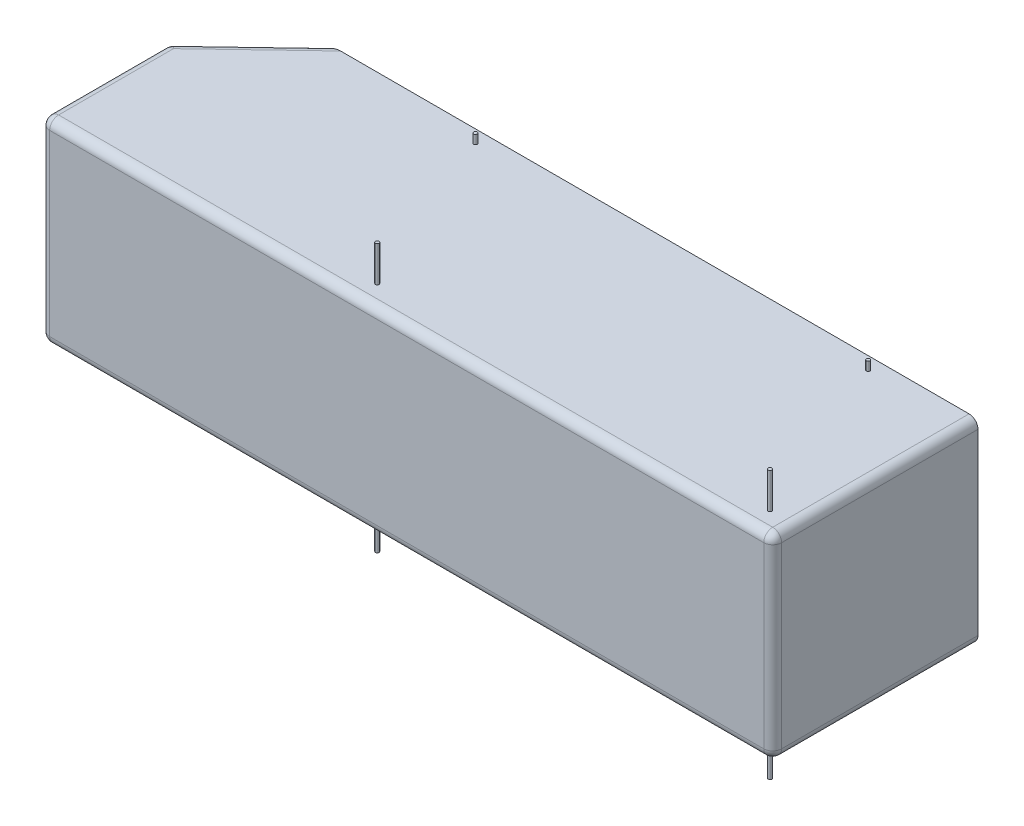
ISO-10303-21;
HEADER;
FILE_DESCRIPTION(('STEP AP214'),'2;1');
FILE_NAME('part.step','',(''),(''),'','','');
FILE_SCHEMA(('AUTOMOTIVE_DESIGN { 1 0 10303 214 1 1 1 1 }'));
ENDSEC;
DATA;
#1=APPLICATION_CONTEXT('core data for automotive mechanical design processes');
#2=APPLICATION_PROTOCOL_DEFINITION('international standard','automotive_design',2000,#1);
#3=PRODUCT_CONTEXT('',#1,'mechanical');
#4=PRODUCT('Part','Part','',(#3));
#5=PRODUCT_RELATED_PRODUCT_CATEGORY('part','',(#4));
#6=PRODUCT_DEFINITION_FORMATION('','',#4);
#7=PRODUCT_DEFINITION_CONTEXT('part definition',#1,'design');
#8=PRODUCT_DEFINITION('design','',#6,#7);
#9=PRODUCT_DEFINITION_SHAPE('','',#8);
#10=(LENGTH_UNIT() NAMED_UNIT(*) SI_UNIT(.MILLI.,.METRE.));
#11=(NAMED_UNIT(*) PLANE_ANGLE_UNIT() SI_UNIT($,.RADIAN.));
#12=(NAMED_UNIT(*) SI_UNIT($,.STERADIAN.) SOLID_ANGLE_UNIT());
#13=UNCERTAINTY_MEASURE_WITH_UNIT(LENGTH_MEASURE(1.E-05),#10,'distance_accuracy_value','');
#14=(GEOMETRIC_REPRESENTATION_CONTEXT(3) GLOBAL_UNCERTAINTY_ASSIGNED_CONTEXT((#13)) GLOBAL_UNIT_ASSIGNED_CONTEXT((#10,
#11,#12)) REPRESENTATION_CONTEXT('',''));
#15=CARTESIAN_POINT('',(0.,0.,0.));
#16=DIRECTION('',(0.,0.,1.));
#17=DIRECTION('',(1.,0.,0.));
#18=AXIS2_PLACEMENT_3D('',#15,#16,#17);
#19=CARTESIAN_POINT('',(-139.,150.,14.));
#20=DIRECTION('',(0.,-1.,0.));
#21=DIRECTION('',(1.,0.,0.));
#22=AXIS2_PLACEMENT_3D('',#19,#20,#21);
#23=CYLINDRICAL_SURFACE('',#22,2.);
#24=CARTESIAN_POINT('',(-139.,110.,14.));
#25=DIRECTION('',(0.,-1.,0.));
#26=DIRECTION('',(1.,0.,0.));
#27=AXIS2_PLACEMENT_3D('',#24,#25,#26);
#28=CIRCLE('',#27,2.);
#29=CARTESIAN_POINT('',(-137.,110.,14.));
#30=VERTEX_POINT('',#29);
#31=EDGE_CURVE('E243',#30,#30,#28,.F.);
#32=ORIENTED_EDGE('',*,*,#31,.T.);
#33=EDGE_LOOP('',(#32));
#34=FACE_BOUND('',#33,.T.);
#35=CARTESIAN_POINT('',(-139.,120.,14.));
#36=DIRECTION('',(0.,1.,0.));
#37=DIRECTION('',(-1.,0.,0.));
#38=AXIS2_PLACEMENT_3D('',#35,#36,#37);
#39=CIRCLE('',#38,2.);
#40=CARTESIAN_POINT('',(-141.,120.,14.));
#41=VERTEX_POINT('',#40);
#42=EDGE_CURVE('E37',#41,#41,#39,.T.);
#43=ORIENTED_EDGE('',*,*,#42,.F.);
#44=EDGE_LOOP('',(#43));
#45=FACE_BOUND('',#44,.T.);
#46=ADVANCED_FACE('F33',(#34,#45),#23,.T.);
#47=CARTESIAN_POINT('',(301.,150.,14.));
#48=DIRECTION('',(0.,-1.,0.));
#49=DIRECTION('',(1.,0.,0.));
#50=AXIS2_PLACEMENT_3D('',#47,#48,#49);
#51=CYLINDRICAL_SURFACE('',#50,2.);
#52=CARTESIAN_POINT('',(301.,110.,14.));
#53=DIRECTION('',(0.,-1.,0.));
#54=DIRECTION('',(1.,0.,0.));
#55=AXIS2_PLACEMENT_3D('',#52,#53,#54);
#56=CIRCLE('',#55,2.);
#57=CARTESIAN_POINT('',(303.,110.,14.));
#58=VERTEX_POINT('',#57);
#59=EDGE_CURVE('E240',#58,#58,#56,.F.);
#60=ORIENTED_EDGE('',*,*,#59,.T.);
#61=EDGE_LOOP('',(#60));
#62=FACE_BOUND('',#61,.T.);
#63=CARTESIAN_POINT('',(301.,120.,14.));
#64=DIRECTION('',(0.,1.,0.));
#65=DIRECTION('',(-1.,0.,0.));
#66=AXIS2_PLACEMENT_3D('',#63,#64,#65);
#67=CIRCLE('',#66,2.);
#68=CARTESIAN_POINT('',(299.,120.,14.));
#69=VERTEX_POINT('',#68);
#70=EDGE_CURVE('E284',#69,#69,#67,.T.);
#71=ORIENTED_EDGE('',*,*,#70,.F.);
#72=EDGE_LOOP('',(#71));
#73=FACE_BOUND('',#72,.T.);
#74=ADVANCED_FACE('F297',(#62,#73),#51,.T.);
#75=CARTESIAN_POINT('',(301.,-150.,14.));
#76=DIRECTION('',(0.,1.,0.));
#77=DIRECTION('',(-1.,0.,0.));
#78=AXIS2_PLACEMENT_3D('',#75,#76,#77);
#79=CYLINDRICAL_SURFACE('',#78,2.);
#80=CARTESIAN_POINT('',(301.,-110.,14.));
#81=DIRECTION('',(0.,1.,0.));
#82=DIRECTION('',(-1.,0.,0.));
#83=AXIS2_PLACEMENT_3D('',#80,#81,#82);
#84=CIRCLE('',#83,2.);
#85=CARTESIAN_POINT('',(299.,-110.,14.));
#86=VERTEX_POINT('',#85);
#87=EDGE_CURVE('E206',#86,#86,#84,.F.);
#88=ORIENTED_EDGE('',*,*,#87,.T.);
#89=EDGE_LOOP('',(#88));
#90=FACE_BOUND('',#89,.T.);
#91=CARTESIAN_POINT('',(301.,-120.,14.));
#92=DIRECTION('',(0.,-1.,0.));
#93=DIRECTION('',(1.,0.,0.));
#94=AXIS2_PLACEMENT_3D('',#91,#92,#93);
#95=CIRCLE('',#94,2.);
#96=CARTESIAN_POINT('',(303.,-120.,14.));
#97=VERTEX_POINT('',#96);
#98=EDGE_CURVE('E286',#97,#97,#95,.T.);
#99=ORIENTED_EDGE('',*,*,#98,.F.);
#100=EDGE_LOOP('',(#99));
#101=FACE_BOUND('',#100,.T.);
#102=ADVANCED_FACE('F303',(#90,#101),#79,.T.);
#103=CARTESIAN_POINT('',(-139.,-150.,14.));
#104=DIRECTION('',(0.,1.,0.));
#105=DIRECTION('',(-1.,0.,0.));
#106=AXIS2_PLACEMENT_3D('',#103,#104,#105);
#107=CYLINDRICAL_SURFACE('',#106,2.);
#108=CARTESIAN_POINT('',(-139.,-110.,14.));
#109=DIRECTION('',(0.,1.,0.));
#110=DIRECTION('',(-1.,0.,0.));
#111=AXIS2_PLACEMENT_3D('',#108,#109,#110);
#112=CIRCLE('',#111,2.);
#113=CARTESIAN_POINT('',(-141.,-110.,14.));
#114=VERTEX_POINT('',#113);
#115=EDGE_CURVE('E231',#114,#114,#112,.F.);
#116=ORIENTED_EDGE('',*,*,#115,.T.);
#117=EDGE_LOOP('',(#116));
#118=FACE_BOUND('',#117,.T.);
#119=CARTESIAN_POINT('',(-139.,-120.,14.));
#120=DIRECTION('',(0.,-1.,0.));
#121=DIRECTION('',(1.,0.,0.));
#122=AXIS2_PLACEMENT_3D('',#119,#120,#121);
#123=CIRCLE('',#122,2.);
#124=CARTESIAN_POINT('',(-137.,-120.,14.));
#125=VERTEX_POINT('',#124);
#126=EDGE_CURVE('E275',#125,#125,#123,.T.);
#127=ORIENTED_EDGE('',*,*,#126,.F.);
#128=EDGE_LOOP('',(#127));
#129=FACE_BOUND('',#128,.T.);
#130=ADVANCED_FACE('F327',(#118,#129),#107,.T.);
#131=CARTESIAN_POINT('',(-400.,-100.,230.));
#132=DIRECTION('',(0.,0.,-1.));
#133=DIRECTION('',(-1.,0.,0.));
#134=AXIS2_PLACEMENT_3D('',#131,#132,#133);
#135=CYLINDRICAL_SURFACE('',#134,9.99999999999999);
#136=DIRECTION('',(0.,0.,-1.));
#137=VECTOR('',#136,1.);
#138=CARTESIAN_POINT('',(-410.,-100.,230.));
#139=LINE('',#138,#137);
#140=CARTESIAN_POINT('',(-410.,-100.,220.));
#141=VERTEX_POINT('',#140);
#142=CARTESIAN_POINT('',(-410.,-100.,91.3643058150663));
#143=VERTEX_POINT('',#142);
#144=EDGE_CURVE('E168',#141,#143,#139,.T.);
#145=ORIENTED_EDGE('',*,*,#144,.T.);
#146=CARTESIAN_POINT('',(-400.,-100.,91.3643058150663));
#147=DIRECTION('',(0.,0.,-1.));
#148=DIRECTION('',(-1.,0.,0.));
#149=AXIS2_PLACEMENT_3D('',#146,#147,#148);
#150=CIRCLE('',#149,9.99999999999999);
#151=CARTESIAN_POINT('',(-400.,-110.,91.3643058150663));
#152=VERTEX_POINT('',#151);
#153=EDGE_CURVE('E42',#143,#152,#150,.F.);
#154=ORIENTED_EDGE('',*,*,#153,.T.);
#155=DIRECTION('',(0.,0.,-1.));
#156=VECTOR('',#155,1.);
#157=CARTESIAN_POINT('',(-400.,-110.,230.));
#158=LINE('',#157,#156);
#159=CARTESIAN_POINT('',(-400.,-110.,220.));
#160=VERTEX_POINT('',#159);
#161=EDGE_CURVE('E150',#160,#152,#158,.T.);
#162=ORIENTED_EDGE('',*,*,#161,.F.);
#163=CARTESIAN_POINT('',(-400.,-100.,220.));
#164=DIRECTION('',(0.,0.,-1.));
#165=DIRECTION('',(-1.,0.,0.));
#166=AXIS2_PLACEMENT_3D('',#163,#164,#165);
#167=CIRCLE('',#166,9.99999999999999);
#168=EDGE_CURVE('E181',#160,#141,#167,.T.);
#169=ORIENTED_EDGE('',*,*,#168,.T.);
#170=EDGE_LOOP('',(#145,#154,#162,#169));
#171=FACE_BOUND('',#170,.T.);
#172=ADVANCED_FACE('F330',(#171),#135,.T.);
#173=CARTESIAN_POINT('',(400.,-110.,230.));
#174=DIRECTION('',(0.,1.,0.));
#175=DIRECTION('',(-1.,0.,0.));
#176=AXIS2_PLACEMENT_3D('',#173,#174,#175);
#177=PLANE('',#176);
#178=CARTESIAN_POINT('',(382.,-110.,205.));
#179=DIRECTION('',(0.,1.,0.));
#180=DIRECTION('',(-1.,0.,0.));
#181=AXIS2_PLACEMENT_3D('',#178,#179,#180);
#182=CIRCLE('',#181,2.);
#183=CARTESIAN_POINT('',(380.,-110.,205.));
#184=VERTEX_POINT('',#183);
#185=EDGE_CURVE('E237',#184,#184,#182,.F.);
#186=ORIENTED_EDGE('',*,*,#185,.F.);
#187=EDGE_LOOP('',(#186));
#188=FACE_BOUND('',#187,.T.);
#189=CARTESIAN_POINT('',(-58.0000000000001,-110.,205.));
#190=DIRECTION('',(0.,1.,0.));
#191=DIRECTION('',(-1.,0.,0.));
#192=AXIS2_PLACEMENT_3D('',#189,#190,#191);
#193=CIRCLE('',#192,2.);
#194=CARTESIAN_POINT('',(-60.0000000000001,-110.,205.));
#195=VERTEX_POINT('',#194);
#196=EDGE_CURVE('E234',#195,#195,#193,.F.);
#197=ORIENTED_EDGE('',*,*,#196,.F.);
#198=EDGE_LOOP('',(#197));
#199=FACE_BOUND('',#198,.T.);
#200=ORIENTED_EDGE('',*,*,#115,.F.);
#201=EDGE_LOOP('',(#200));
#202=FACE_BOUND('',#201,.T.);
#203=ORIENTED_EDGE('',*,*,#87,.F.);
#204=EDGE_LOOP('',(#203));
#205=FACE_BOUND('',#204,.T.);
#206=ORIENTED_EDGE('',*,*,#161,.T.);
#207=DIRECTION('',(-0.724195431730641,0.,0.689594791642505));
#208=VECTOR('',#207,1.);
#209=CARTESIAN_POINT('',(-49.6676407966176,-110.,-242.229859054425));
#210=LINE('',#209,#208);
#211=CARTESIAN_POINT('',(-304.051460805096,-110.,0.));
#212=VERTEX_POINT('',#211);
#213=EDGE_CURVE('E11',#152,#212,#210,.F.);
#214=ORIENTED_EDGE('',*,*,#213,.T.);
#215=DIRECTION('',(1.,0.,0.));
#216=VECTOR('',#215,1.);
#217=CARTESIAN_POINT('',(400.,-110.,0.));
#218=LINE('',#217,#216);
#219=CARTESIAN_POINT('',(400.,-110.,0.));
#220=VERTEX_POINT('',#219);
#221=EDGE_CURVE('E131',#212,#220,#218,.T.);
#222=ORIENTED_EDGE('',*,*,#221,.T.);
#223=DIRECTION('',(0.,0.,-1.));
#224=VECTOR('',#223,1.);
#225=CARTESIAN_POINT('',(400.,-110.,230.));
#226=LINE('',#225,#224);
#227=CARTESIAN_POINT('',(400.,-110.,220.));
#228=VERTEX_POINT('',#227);
#229=EDGE_CURVE('E134',#228,#220,#226,.T.);
#230=ORIENTED_EDGE('',*,*,#229,.F.);
#231=DIRECTION('',(1.,0.,0.));
#232=VECTOR('',#231,1.);
#233=CARTESIAN_POINT('',(400.,-110.,220.));
#234=LINE('',#233,#232);
#235=EDGE_CURVE('E204',#228,#160,#234,.F.);
#236=ORIENTED_EDGE('',*,*,#235,.T.);
#237=EDGE_LOOP('',(#206,#214,#222,#230,#236));
#238=FACE_BOUND('',#237,.T.);
#239=ADVANCED_FACE('F133',(#188,#199,#202,#205,#238),#177,.F.);
#240=CARTESIAN_POINT('',(400.,-99.9999999999999,230.));
#241=DIRECTION('',(0.,0.,-1.));
#242=DIRECTION('',(-1.,0.,0.));
#243=AXIS2_PLACEMENT_3D('',#240,#241,#242);
#244=CYLINDRICAL_SURFACE('',#243,10.);
#245=DIRECTION('',(0.,0.,-1.));
#246=VECTOR('',#245,1.);
#247=CARTESIAN_POINT('',(410.,-99.9999999999999,230.));
#248=LINE('',#247,#246);
#249=CARTESIAN_POINT('',(410.,-99.9999999999999,220.));
#250=VERTEX_POINT('',#249);
#251=CARTESIAN_POINT('',(410.,-99.9999999999999,0.));
#252=VERTEX_POINT('',#251);
#253=EDGE_CURVE('E151',#250,#252,#248,.T.);
#254=ORIENTED_EDGE('',*,*,#253,.F.);
#255=CARTESIAN_POINT('',(400.,-99.9999999999999,220.));
#256=DIRECTION('',(0.,0.,-1.));
#257=DIRECTION('',(-1.,0.,0.));
#258=AXIS2_PLACEMENT_3D('',#255,#256,#257);
#259=CIRCLE('',#258,10.);
#260=EDGE_CURVE('E149',#250,#228,#259,.T.);
#261=ORIENTED_EDGE('',*,*,#260,.T.);
#262=ORIENTED_EDGE('',*,*,#229,.T.);
#263=CARTESIAN_POINT('',(400.,-99.9999999999999,0.));
#264=DIRECTION('',(0.,0.,1.));
#265=DIRECTION('',(1.,0.,0.));
#266=AXIS2_PLACEMENT_3D('',#263,#264,#265);
#267=CIRCLE('',#266,10.);
#268=EDGE_CURVE('E140',#220,#252,#267,.T.);
#269=ORIENTED_EDGE('',*,*,#268,.T.);
#270=EDGE_LOOP('',(#254,#261,#262,#269));
#271=FACE_BOUND('',#270,.T.);
#272=ADVANCED_FACE('F146',(#271),#244,.T.);
#273=CARTESIAN_POINT('',(410.,100.,230.));
#274=DIRECTION('',(-1.,0.,0.));
#275=DIRECTION('',(0.,0.,1.));
#276=AXIS2_PLACEMENT_3D('',#273,#274,#275);
#277=PLANE('',#276);
#278=DIRECTION('',(0.,0.,-1.));
#279=VECTOR('',#278,1.);
#280=CARTESIAN_POINT('',(410.,100.,230.));
#281=LINE('',#280,#279);
#282=CARTESIAN_POINT('',(410.,100.,220.));
#283=VERTEX_POINT('',#282);
#284=CARTESIAN_POINT('',(410.,100.,0.));
#285=VERTEX_POINT('',#284);
#286=EDGE_CURVE('E177',#283,#285,#281,.T.);
#287=ORIENTED_EDGE('',*,*,#286,.F.);
#288=DIRECTION('',(0.,1.,0.));
#289=VECTOR('',#288,1.);
#290=CARTESIAN_POINT('',(410.,100.,220.));
#291=LINE('',#290,#289);
#292=EDGE_CURVE('E201',#283,#250,#291,.F.);
#293=ORIENTED_EDGE('',*,*,#292,.T.);
#294=ORIENTED_EDGE('',*,*,#253,.T.);
#295=DIRECTION('',(0.,1.,0.));
#296=VECTOR('',#295,1.);
#297=CARTESIAN_POINT('',(410.,100.,0.));
#298=LINE('',#297,#296);
#299=EDGE_CURVE('E157',#252,#285,#298,.T.);
#300=ORIENTED_EDGE('',*,*,#299,.T.);
#301=EDGE_LOOP('',(#287,#293,#294,#300));
#302=FACE_BOUND('',#301,.T.);
#303=ADVANCED_FACE('F356',(#302),#277,.F.);
#304=CARTESIAN_POINT('',(400.,100.,230.));
#305=DIRECTION('',(0.,0.,-1.));
#306=DIRECTION('',(-1.,0.,0.));
#307=AXIS2_PLACEMENT_3D('',#304,#305,#306);
#308=CYLINDRICAL_SURFACE('',#307,10.);
#309=DIRECTION('',(0.,0.,-1.));
#310=VECTOR('',#309,1.);
#311=CARTESIAN_POINT('',(400.,110.,230.));
#312=LINE('',#311,#310);
#313=CARTESIAN_POINT('',(400.,110.,220.));
#314=VERTEX_POINT('',#313);
#315=CARTESIAN_POINT('',(400.,110.,0.));
#316=VERTEX_POINT('',#315);
#317=EDGE_CURVE('E175',#314,#316,#312,.T.);
#318=ORIENTED_EDGE('',*,*,#317,.F.);
#319=CARTESIAN_POINT('',(400.,100.,220.));
#320=DIRECTION('',(0.,0.,-1.));
#321=DIRECTION('',(-1.,0.,0.));
#322=AXIS2_PLACEMENT_3D('',#319,#320,#321);
#323=CIRCLE('',#322,10.);
#324=EDGE_CURVE('E199',#314,#283,#323,.T.);
#325=ORIENTED_EDGE('',*,*,#324,.T.);
#326=ORIENTED_EDGE('',*,*,#286,.T.);
#327=CARTESIAN_POINT('',(400.,100.,0.));
#328=DIRECTION('',(0.,0.,1.));
#329=DIRECTION('',(1.,0.,0.));
#330=AXIS2_PLACEMENT_3D('',#327,#328,#329);
#331=CIRCLE('',#330,10.);
#332=EDGE_CURVE('E159',#285,#316,#331,.T.);
#333=ORIENTED_EDGE('',*,*,#332,.T.);
#334=EDGE_LOOP('',(#318,#325,#326,#333));
#335=FACE_BOUND('',#334,.T.);
#336=ADVANCED_FACE('F352',(#335),#308,.T.);
#337=CARTESIAN_POINT('',(400.,110.,230.));
#338=DIRECTION('',(0.,-1.,0.));
#339=DIRECTION('',(1.,0.,0.));
#340=AXIS2_PLACEMENT_3D('',#337,#338,#339);
#341=PLANE('',#340);
#342=CARTESIAN_POINT('',(-58.,110.,205.));
#343=DIRECTION('',(0.,-1.,0.));
#344=DIRECTION('',(1.,0.,0.));
#345=AXIS2_PLACEMENT_3D('',#342,#343,#344);
#346=CIRCLE('',#345,2.);
#347=CARTESIAN_POINT('',(-56.,110.,205.));
#348=VERTEX_POINT('',#347);
#349=EDGE_CURVE('E249',#348,#348,#346,.F.);
#350=ORIENTED_EDGE('',*,*,#349,.F.);
#351=EDGE_LOOP('',(#350));
#352=FACE_BOUND('',#351,.T.);
#353=CARTESIAN_POINT('',(382.,110.,205.));
#354=DIRECTION('',(0.,-1.,0.));
#355=DIRECTION('',(1.,0.,0.));
#356=AXIS2_PLACEMENT_3D('',#353,#354,#355);
#357=CIRCLE('',#356,2.);
#358=CARTESIAN_POINT('',(384.,110.,205.));
#359=VERTEX_POINT('',#358);
#360=EDGE_CURVE('E246',#359,#359,#357,.F.);
#361=ORIENTED_EDGE('',*,*,#360,.F.);
#362=EDGE_LOOP('',(#361));
#363=FACE_BOUND('',#362,.T.);
#364=ORIENTED_EDGE('',*,*,#31,.F.);
#365=EDGE_LOOP('',(#364));
#366=FACE_BOUND('',#365,.T.);
#367=ORIENTED_EDGE('',*,*,#59,.F.);
#368=EDGE_LOOP('',(#367));
#369=FACE_BOUND('',#368,.T.);
#370=DIRECTION('',(-1.,0.,0.));
#371=VECTOR('',#370,1.);
#372=CARTESIAN_POINT('',(400.,110.,0.));
#373=LINE('',#372,#371);
#374=CARTESIAN_POINT('',(-304.051460805096,110.,0.));
#375=VERTEX_POINT('',#374);
#376=EDGE_CURVE('E165',#316,#375,#373,.T.);
#377=ORIENTED_EDGE('',*,*,#376,.T.);
#378=DIRECTION('',(-0.724195431730641,0.,0.689594791642505));
#379=VECTOR('',#378,1.);
#380=CARTESIAN_POINT('',(-49.6676407966176,110.,-242.229859054425));
#381=LINE('',#380,#379);
#382=CARTESIAN_POINT('',(-400.,110.,91.3643058150662));
#383=VERTEX_POINT('',#382);
#384=EDGE_CURVE('E255',#375,#383,#381,.T.);
#385=ORIENTED_EDGE('',*,*,#384,.T.);
#386=DIRECTION('',(0.,0.,-1.));
#387=VECTOR('',#386,1.);
#388=CARTESIAN_POINT('',(-400.,110.,230.));
#389=LINE('',#388,#387);
#390=CARTESIAN_POINT('',(-400.,110.,220.));
#391=VERTEX_POINT('',#390);
#392=EDGE_CURVE('E172',#391,#383,#389,.T.);
#393=ORIENTED_EDGE('',*,*,#392,.F.);
#394=DIRECTION('',(-1.,0.,0.));
#395=VECTOR('',#394,1.);
#396=CARTESIAN_POINT('',(400.,110.,220.));
#397=LINE('',#396,#395);
#398=EDGE_CURVE('E197',#391,#314,#397,.F.);
#399=ORIENTED_EDGE('',*,*,#398,.T.);
#400=ORIENTED_EDGE('',*,*,#317,.T.);
#401=EDGE_LOOP('',(#377,#385,#393,#399,#400));
#402=FACE_BOUND('',#401,.T.);
#403=ADVANCED_FACE('F348',(#352,#363,#366,#369,#402),#341,.F.);
#404=CARTESIAN_POINT('',(-400.,99.9999999999999,230.));
#405=DIRECTION('',(0.,0.,-1.));
#406=DIRECTION('',(-1.,0.,0.));
#407=AXIS2_PLACEMENT_3D('',#404,#405,#406);
#408=CYLINDRICAL_SURFACE('',#407,9.99999999999999);
#409=ORIENTED_EDGE('',*,*,#392,.T.);
#410=CARTESIAN_POINT('',(-400.,99.9999999999999,91.3643058150662));
#411=DIRECTION('',(0.,0.,-1.));
#412=DIRECTION('',(-1.,0.,0.));
#413=AXIS2_PLACEMENT_3D('',#410,#411,#412);
#414=CIRCLE('',#413,9.99999999999999);
#415=CARTESIAN_POINT('',(-410.,99.9999999999999,91.3643058150662));
#416=VERTEX_POINT('',#415);
#417=EDGE_CURVE('E268',#383,#416,#414,.F.);
#418=ORIENTED_EDGE('',*,*,#417,.T.);
#419=DIRECTION('',(0.,0.,-1.));
#420=VECTOR('',#419,1.);
#421=CARTESIAN_POINT('',(-410.,99.9999999999999,230.));
#422=LINE('',#421,#420);
#423=CARTESIAN_POINT('',(-410.,99.9999999999999,220.));
#424=VERTEX_POINT('',#423);
#425=EDGE_CURVE('E170',#424,#416,#422,.T.);
#426=ORIENTED_EDGE('',*,*,#425,.F.);
#427=CARTESIAN_POINT('',(-400.,99.9999999999999,220.));
#428=DIRECTION('',(0.,0.,-1.));
#429=DIRECTION('',(-1.,0.,0.));
#430=AXIS2_PLACEMENT_3D('',#427,#428,#429);
#431=CIRCLE('',#430,9.99999999999999);
#432=EDGE_CURVE('E195',#424,#391,#431,.T.);
#433=ORIENTED_EDGE('',*,*,#432,.T.);
#434=EDGE_LOOP('',(#409,#418,#426,#433));
#435=FACE_BOUND('',#434,.T.);
#436=ADVANCED_FACE('F345',(#435),#408,.T.);
#437=CARTESIAN_POINT('',(-410.,99.9999999999999,230.));
#438=DIRECTION('',(1.,0.,0.));
#439=DIRECTION('',(0.,0.,-1.));
#440=AXIS2_PLACEMENT_3D('',#437,#438,#439);
#441=PLANE('',#440);
#442=ORIENTED_EDGE('',*,*,#425,.T.);
#443=DIRECTION('',(0.,-1.,0.));
#444=VECTOR('',#443,1.);
#445=CARTESIAN_POINT('',(-410.,99.9999999999999,91.3643058150662));
#446=LINE('',#445,#444);
#447=EDGE_CURVE('E57',#416,#143,#446,.T.);
#448=ORIENTED_EDGE('',*,*,#447,.T.);
#449=ORIENTED_EDGE('',*,*,#144,.F.);
#450=DIRECTION('',(0.,-1.,0.));
#451=VECTOR('',#450,1.);
#452=CARTESIAN_POINT('',(-410.,99.9999999999999,220.));
#453=LINE('',#452,#451);
#454=EDGE_CURVE('E193',#141,#424,#453,.F.);
#455=ORIENTED_EDGE('',*,*,#454,.T.);
#456=EDGE_LOOP('',(#442,#448,#449,#455));
#457=FACE_BOUND('',#456,.T.);
#458=ADVANCED_FACE('F338',(#457),#441,.F.);
#459=CARTESIAN_POINT('',(-400.,-100.,230.));
#460=DIRECTION('',(0.,0.,-1.));
#461=DIRECTION('',(-1.,0.,0.));
#462=AXIS2_PLACEMENT_3D('',#459,#460,#461);
#463=PLANE('',#462);
#464=DIRECTION('',(-1.,0.,0.));
#465=VECTOR('',#464,1.);
#466=CARTESIAN_POINT('',(-400.,99.9999999999999,230.));
#467=LINE('',#466,#465);
#468=CARTESIAN_POINT('',(400.,100.,230.));
#469=VERTEX_POINT('',#468);
#470=CARTESIAN_POINT('',(-400.,99.9999999999999,230.));
#471=VERTEX_POINT('',#470);
#472=EDGE_CURVE('E188',#469,#471,#467,.T.);
#473=ORIENTED_EDGE('',*,*,#472,.T.);
#474=DIRECTION('',(0.,-1.,0.));
#475=VECTOR('',#474,1.);
#476=CARTESIAN_POINT('',(-400.,-100.,230.));
#477=LINE('',#476,#475);
#478=CARTESIAN_POINT('',(-400.,-100.,230.));
#479=VERTEX_POINT('',#478);
#480=EDGE_CURVE('E190',#471,#479,#477,.T.);
#481=ORIENTED_EDGE('',*,*,#480,.T.);
#482=DIRECTION('',(1.,0.,0.));
#483=VECTOR('',#482,1.);
#484=CARTESIAN_POINT('',(-400.,-100.,230.));
#485=LINE('',#484,#483);
#486=CARTESIAN_POINT('',(400.,-99.9999999999999,230.));
#487=VERTEX_POINT('',#486);
#488=EDGE_CURVE('E184',#479,#487,#485,.T.);
#489=ORIENTED_EDGE('',*,*,#488,.T.);
#490=DIRECTION('',(0.,1.,0.));
#491=VECTOR('',#490,1.);
#492=CARTESIAN_POINT('',(400.,-100.,230.));
#493=LINE('',#492,#491);
#494=EDGE_CURVE('E186',#487,#469,#493,.T.);
#495=ORIENTED_EDGE('',*,*,#494,.T.);
#496=EDGE_LOOP('',(#473,#481,#489,#495));
#497=FACE_BOUND('',#496,.T.);
#498=ADVANCED_FACE('F335',(#497),#463,.F.);
#499=CARTESIAN_POINT('',(-400.,-100.,0.));
#500=DIRECTION('',(0.,0.,-1.));
#501=DIRECTION('',(-1.,0.,0.));
#502=AXIS2_PLACEMENT_3D('',#499,#500,#501);
#503=PLANE('',#502);
#504=DIRECTION('',(0.,-1.,0.));
#505=VECTOR('',#504,1.);
#506=CARTESIAN_POINT('',(-318.55273042197,-100.,0.));
#507=LINE('',#506,#505);
#508=CARTESIAN_POINT('',(-318.55273042197,100.,0.));
#509=VERTEX_POINT('',#508);
#510=CARTESIAN_POINT('',(-318.55273042197,-100.,0.));
#511=VERTEX_POINT('',#510);
#512=EDGE_CURVE('E252',#509,#511,#507,.T.);
#513=ORIENTED_EDGE('',*,*,#512,.F.);
#514=CARTESIAN_POINT('',(-304.051460805097,99.9999999999999,0.));
#515=DIRECTION('',(0.,0.,-1.));
#516=DIRECTION('',(-1.,0.,0.));
#517=AXIS2_PLACEMENT_3D('',#514,#515,#516);
#518=ELLIPSE('',#517,14.501269616874,10.);
#519=EDGE_CURVE('E266',#509,#375,#518,.T.);
#520=ORIENTED_EDGE('',*,*,#519,.T.);
#521=ORIENTED_EDGE('',*,*,#376,.F.);
#522=ORIENTED_EDGE('',*,*,#332,.F.);
#523=ORIENTED_EDGE('',*,*,#299,.F.);
#524=ORIENTED_EDGE('',*,*,#268,.F.);
#525=ORIENTED_EDGE('',*,*,#221,.F.);
#526=CARTESIAN_POINT('',(-304.051460805096,-100.,0.));
#527=DIRECTION('',(0.,0.,-1.));
#528=DIRECTION('',(-1.,0.,0.));
#529=AXIS2_PLACEMENT_3D('',#526,#527,#528);
#530=ELLIPSE('',#529,14.501269616874,10.);
#531=EDGE_CURVE('E264',#212,#511,#530,.T.);
#532=ORIENTED_EDGE('',*,*,#531,.T.);
#533=EDGE_LOOP('',(#513,#520,#521,#522,#523,#524,#525,#532));
#534=FACE_BOUND('',#533,.T.);
#535=ADVANCED_FACE('F154',(#534),#503,.T.);
#536=CARTESIAN_POINT('',(400.,100.,220.));
#537=DIRECTION('',(0.,0.,-1.));
#538=DIRECTION('',(-1.,0.,0.));
#539=AXIS2_PLACEMENT_3D('',#536,#537,#538);
#540=SPHERICAL_SURFACE('',#539,10.);
#541=CARTESIAN_POINT('',(400.,100.,220.));
#542=DIRECTION('',(0.,-1.,0.));
#543=DIRECTION('',(0.,0.,-1.));
#544=AXIS2_PLACEMENT_3D('',#541,#542,#543);
#545=CIRCLE('',#544,10.);
#546=EDGE_CURVE('E224',#283,#469,#545,.T.);
#547=ORIENTED_EDGE('',*,*,#546,.F.);
#548=ORIENTED_EDGE('',*,*,#324,.F.);
#549=CARTESIAN_POINT('',(400.,100.,220.));
#550=DIRECTION('',(-1.,0.,0.));
#551=DIRECTION('',(0.,0.,1.));
#552=AXIS2_PLACEMENT_3D('',#549,#550,#551);
#553=CIRCLE('',#552,10.);
#554=EDGE_CURVE('E141',#469,#314,#553,.T.);
#555=ORIENTED_EDGE('',*,*,#554,.F.);
#556=EDGE_LOOP('',(#547,#548,#555));
#557=FACE_BOUND('',#556,.T.);
#558=ADVANCED_FACE('F342',(#557),#540,.T.);
#559=CARTESIAN_POINT('',(-400.,99.9999999999999,220.));
#560=DIRECTION('',(-1.,0.,0.));
#561=DIRECTION('',(0.,-1.,0.));
#562=AXIS2_PLACEMENT_3D('',#559,#560,#561);
#563=CYLINDRICAL_SURFACE('',#562,10.);
#564=ORIENTED_EDGE('',*,*,#554,.T.);
#565=ORIENTED_EDGE('',*,*,#398,.F.);
#566=CARTESIAN_POINT('',(-400.,99.9999999999999,220.));
#567=DIRECTION('',(-1.,0.,0.));
#568=DIRECTION('',(0.,0.,1.));
#569=AXIS2_PLACEMENT_3D('',#566,#567,#568);
#570=CIRCLE('',#569,10.);
#571=EDGE_CURVE('E221',#471,#391,#570,.T.);
#572=ORIENTED_EDGE('',*,*,#571,.F.);
#573=ORIENTED_EDGE('',*,*,#472,.F.);
#574=EDGE_LOOP('',(#564,#565,#572,#573));
#575=FACE_BOUND('',#574,.T.);
#576=ADVANCED_FACE('F390',(#575),#563,.T.);
#577=CARTESIAN_POINT('',(400.,-100.,220.));
#578=DIRECTION('',(0.,1.,0.));
#579=DIRECTION('',(0.,0.,1.));
#580=AXIS2_PLACEMENT_3D('',#577,#578,#579);
#581=CYLINDRICAL_SURFACE('',#580,10.);
#582=ORIENTED_EDGE('',*,*,#546,.T.);
#583=ORIENTED_EDGE('',*,*,#494,.F.);
#584=CARTESIAN_POINT('',(400.,-99.9999999999999,220.));
#585=DIRECTION('',(0.,-1.,0.));
#586=DIRECTION('',(0.,0.,-1.));
#587=AXIS2_PLACEMENT_3D('',#584,#585,#586);
#588=CIRCLE('',#587,10.);
#589=EDGE_CURVE('E218',#250,#487,#588,.T.);
#590=ORIENTED_EDGE('',*,*,#589,.F.);
#591=ORIENTED_EDGE('',*,*,#292,.F.);
#592=EDGE_LOOP('',(#582,#583,#590,#591));
#593=FACE_BOUND('',#592,.T.);
#594=ADVANCED_FACE('F386',(#593),#581,.T.);
#595=CARTESIAN_POINT('',(-400.,99.9999999999999,220.));
#596=DIRECTION('',(0.,0.,-1.));
#597=DIRECTION('',(-1.,0.,0.));
#598=AXIS2_PLACEMENT_3D('',#595,#596,#597);
#599=SPHERICAL_SURFACE('',#598,10.);
#600=ORIENTED_EDGE('',*,*,#571,.T.);
#601=ORIENTED_EDGE('',*,*,#432,.F.);
#602=CARTESIAN_POINT('',(-400.,99.9999999999999,220.));
#603=DIRECTION('',(0.,-1.,0.));
#604=DIRECTION('',(0.,0.,-1.));
#605=AXIS2_PLACEMENT_3D('',#602,#603,#604);
#606=CIRCLE('',#605,10.);
#607=EDGE_CURVE('E215',#471,#424,#606,.T.);
#608=ORIENTED_EDGE('',*,*,#607,.F.);
#609=EDGE_LOOP('',(#600,#601,#608));
#610=FACE_BOUND('',#609,.T.);
#611=ADVANCED_FACE('F382',(#610),#599,.T.);
#612=CARTESIAN_POINT('',(400.,-99.9999999999999,220.));
#613=DIRECTION('',(0.,0.,-1.));
#614=DIRECTION('',(-1.,0.,0.));
#615=AXIS2_PLACEMENT_3D('',#612,#613,#614);
#616=SPHERICAL_SURFACE('',#615,10.);
#617=ORIENTED_EDGE('',*,*,#260,.F.);
#618=ORIENTED_EDGE('',*,*,#589,.T.);
#619=CARTESIAN_POINT('',(400.,-99.9999999999999,220.));
#620=DIRECTION('',(-1.,0.,0.));
#621=DIRECTION('',(0.,0.,1.));
#622=AXIS2_PLACEMENT_3D('',#619,#620,#621);
#623=CIRCLE('',#622,10.);
#624=EDGE_CURVE('E212',#228,#487,#623,.T.);
#625=ORIENTED_EDGE('',*,*,#624,.F.);
#626=EDGE_LOOP('',(#617,#618,#625));
#627=FACE_BOUND('',#626,.T.);
#628=ADVANCED_FACE('F378',(#627),#616,.T.);
#629=CARTESIAN_POINT('',(-400.,-100.,220.));
#630=DIRECTION('',(0.,-1.,0.));
#631=DIRECTION('',(0.,0.,-1.));
#632=AXIS2_PLACEMENT_3D('',#629,#630,#631);
#633=CYLINDRICAL_SURFACE('',#632,10.);
#634=ORIENTED_EDGE('',*,*,#607,.T.);
#635=ORIENTED_EDGE('',*,*,#454,.F.);
#636=CARTESIAN_POINT('',(-400.,-100.,220.));
#637=DIRECTION('',(0.,-1.,0.));
#638=DIRECTION('',(0.,0.,-1.));
#639=AXIS2_PLACEMENT_3D('',#636,#637,#638);
#640=CIRCLE('',#639,10.);
#641=EDGE_CURVE('E209',#479,#141,#640,.T.);
#642=ORIENTED_EDGE('',*,*,#641,.F.);
#643=ORIENTED_EDGE('',*,*,#480,.F.);
#644=EDGE_LOOP('',(#634,#635,#642,#643));
#645=FACE_BOUND('',#644,.T.);
#646=ADVANCED_FACE('F374',(#645),#633,.T.);
#647=CARTESIAN_POINT('',(-400.,-100.,220.));
#648=DIRECTION('',(1.,0.,0.));
#649=DIRECTION('',(0.,1.,0.));
#650=AXIS2_PLACEMENT_3D('',#647,#648,#649);
#651=CYLINDRICAL_SURFACE('',#650,10.);
#652=ORIENTED_EDGE('',*,*,#624,.T.);
#653=ORIENTED_EDGE('',*,*,#488,.F.);
#654=CARTESIAN_POINT('',(-400.,-100.,220.));
#655=DIRECTION('',(-1.,0.,0.));
#656=DIRECTION('',(0.,0.,1.));
#657=AXIS2_PLACEMENT_3D('',#654,#655,#656);
#658=CIRCLE('',#657,10.);
#659=EDGE_CURVE('E207',#160,#479,#658,.T.);
#660=ORIENTED_EDGE('',*,*,#659,.F.);
#661=ORIENTED_EDGE('',*,*,#235,.F.);
#662=EDGE_LOOP('',(#652,#653,#660,#661));
#663=FACE_BOUND('',#662,.T.);
#664=ADVANCED_FACE('F370',(#663),#651,.T.);
#665=CARTESIAN_POINT('',(-400.,-100.,220.));
#666=DIRECTION('',(0.,0.,-1.));
#667=DIRECTION('',(-1.,0.,0.));
#668=AXIS2_PLACEMENT_3D('',#665,#666,#667);
#669=SPHERICAL_SURFACE('',#668,10.);
#670=ORIENTED_EDGE('',*,*,#641,.T.);
#671=ORIENTED_EDGE('',*,*,#168,.F.);
#672=ORIENTED_EDGE('',*,*,#659,.T.);
#673=EDGE_LOOP('',(#670,#671,#672));
#674=FACE_BOUND('',#673,.T.);
#675=ADVANCED_FACE('F325',(#674),#669,.T.);
#676=CARTESIAN_POINT('',(-58.0000000000001,-150.,205.));
#677=DIRECTION('',(0.,1.,0.));
#678=DIRECTION('',(-1.,0.,0.));
#679=AXIS2_PLACEMENT_3D('',#676,#677,#678);
#680=CYLINDRICAL_SURFACE('',#679,2.);
#681=CARTESIAN_POINT('',(-58.0000000000001,-150.,205.));
#682=DIRECTION('',(0.,-1.,0.));
#683=DIRECTION('',(1.,0.,0.));
#684=AXIS2_PLACEMENT_3D('',#681,#682,#683);
#685=CIRCLE('',#684,2.);
#686=CARTESIAN_POINT('',(-56.0000000000001,-150.,205.));
#687=VERTEX_POINT('',#686);
#688=EDGE_CURVE('E210',#687,#687,#685,.T.);
#689=ORIENTED_EDGE('',*,*,#688,.F.);
#690=EDGE_LOOP('',(#689));
#691=FACE_BOUND('',#690,.T.);
#692=ORIENTED_EDGE('',*,*,#196,.T.);
#693=EDGE_LOOP('',(#692));
#694=FACE_BOUND('',#693,.T.);
#695=ADVANCED_FACE('F321',(#691,#694),#680,.T.);
#696=CARTESIAN_POINT('',(-58.0000000000001,-150.,205.));
#697=DIRECTION('',(0.,-1.,0.));
#698=DIRECTION('',(1.,0.,0.));
#699=AXIS2_PLACEMENT_3D('',#696,#697,#698);
#700=PLANE('',#699);
#701=ORIENTED_EDGE('',*,*,#688,.T.);
#702=EDGE_LOOP('',(#701));
#703=FACE_BOUND('',#702,.T.);
#704=ADVANCED_FACE('F317',(#703),#700,.T.);
#705=CARTESIAN_POINT('',(382.,-150.,205.));
#706=DIRECTION('',(0.,1.,0.));
#707=DIRECTION('',(-1.,0.,0.));
#708=AXIS2_PLACEMENT_3D('',#705,#706,#707);
#709=CYLINDRICAL_SURFACE('',#708,2.);
#710=CARTESIAN_POINT('',(382.,-150.,205.));
#711=DIRECTION('',(0.,-1.,0.));
#712=DIRECTION('',(1.,0.,0.));
#713=AXIS2_PLACEMENT_3D('',#710,#711,#712);
#714=CIRCLE('',#713,2.);
#715=CARTESIAN_POINT('',(384.,-150.,205.));
#716=VERTEX_POINT('',#715);
#717=EDGE_CURVE('E477',#716,#716,#714,.T.);
#718=ORIENTED_EDGE('',*,*,#717,.F.);
#719=EDGE_LOOP('',(#718));
#720=FACE_BOUND('',#719,.T.);
#721=ORIENTED_EDGE('',*,*,#185,.T.);
#722=EDGE_LOOP('',(#721));
#723=FACE_BOUND('',#722,.T.);
#724=ADVANCED_FACE('F313',(#720,#723),#709,.T.);
#725=CARTESIAN_POINT('',(382.,-150.,205.));
#726=DIRECTION('',(0.,-1.,0.));
#727=DIRECTION('',(1.,0.,0.));
#728=AXIS2_PLACEMENT_3D('',#725,#726,#727);
#729=PLANE('',#728);
#730=ORIENTED_EDGE('',*,*,#717,.T.);
#731=EDGE_LOOP('',(#730));
#732=FACE_BOUND('',#731,.T.);
#733=ADVANCED_FACE('F310',(#732),#729,.T.);
#734=CARTESIAN_POINT('',(382.,150.,205.));
#735=DIRECTION('',(0.,-1.,0.));
#736=DIRECTION('',(1.,0.,0.));
#737=AXIS2_PLACEMENT_3D('',#734,#735,#736);
#738=CYLINDRICAL_SURFACE('',#737,2.);
#739=CARTESIAN_POINT('',(382.,150.,205.));
#740=DIRECTION('',(0.,1.,0.));
#741=DIRECTION('',(-1.,0.,0.));
#742=AXIS2_PLACEMENT_3D('',#739,#740,#741);
#743=CIRCLE('',#742,2.);
#744=CARTESIAN_POINT('',(380.,150.,205.));
#745=VERTEX_POINT('',#744);
#746=EDGE_CURVE('E476',#745,#745,#743,.T.);
#747=ORIENTED_EDGE('',*,*,#746,.F.);
#748=EDGE_LOOP('',(#747));
#749=FACE_BOUND('',#748,.T.);
#750=ORIENTED_EDGE('',*,*,#360,.T.);
#751=EDGE_LOOP('',(#750));
#752=FACE_BOUND('',#751,.T.);
#753=ADVANCED_FACE('F307',(#749,#752),#738,.T.);
#754=CARTESIAN_POINT('',(382.,150.,205.));
#755=DIRECTION('',(0.,1.,0.));
#756=DIRECTION('',(-1.,0.,0.));
#757=AXIS2_PLACEMENT_3D('',#754,#755,#756);
#758=PLANE('',#757);
#759=ORIENTED_EDGE('',*,*,#746,.T.);
#760=EDGE_LOOP('',(#759));
#761=FACE_BOUND('',#760,.T.);
#762=ADVANCED_FACE('F466',(#761),#758,.T.);
#763=CARTESIAN_POINT('',(-58.,150.,205.));
#764=DIRECTION('',(0.,-1.,0.));
#765=DIRECTION('',(1.,0.,0.));
#766=AXIS2_PLACEMENT_3D('',#763,#764,#765);
#767=CYLINDRICAL_SURFACE('',#766,2.);
#768=CARTESIAN_POINT('',(-58.,150.,205.));
#769=DIRECTION('',(0.,1.,0.));
#770=DIRECTION('',(-1.,0.,0.));
#771=AXIS2_PLACEMENT_3D('',#768,#769,#770);
#772=CIRCLE('',#771,2.);
#773=CARTESIAN_POINT('',(-60.,150.,205.));
#774=VERTEX_POINT('',#773);
#775=EDGE_CURVE('E283',#774,#774,#772,.T.);
#776=ORIENTED_EDGE('',*,*,#775,.F.);
#777=EDGE_LOOP('',(#776));
#778=FACE_BOUND('',#777,.T.);
#779=ORIENTED_EDGE('',*,*,#349,.T.);
#780=EDGE_LOOP('',(#779));
#781=FACE_BOUND('',#780,.T.);
#782=ADVANCED_FACE('F459',(#778,#781),#767,.T.);
#783=CARTESIAN_POINT('',(-58.,150.,205.));
#784=DIRECTION('',(0.,1.,0.));
#785=DIRECTION('',(-1.,0.,0.));
#786=AXIS2_PLACEMENT_3D('',#783,#784,#785);
#787=PLANE('',#786);
#788=ORIENTED_EDGE('',*,*,#775,.T.);
#789=EDGE_LOOP('',(#788));
#790=FACE_BOUND('',#789,.T.);
#791=ADVANCED_FACE('F454',(#790),#787,.T.);
#792=CARTESIAN_POINT('',(-318.55273042197,190.,0.));
#793=DIRECTION('',(0.689594791642505,0.,0.724195431730641));
#794=DIRECTION('',(0.724195431730641,0.,-0.689594791642505));
#795=AXIS2_PLACEMENT_3D('',#792,#793,#794);
#796=PLANE('',#795);
#797=DIRECTION('',(0.,-1.,0.));
#798=VECTOR('',#797,1.);
#799=CARTESIAN_POINT('',(-406.895947916425,190.,84.1223514977598));
#800=LINE('',#799,#798);
#801=CARTESIAN_POINT('',(-406.895947916425,-100.,84.1223514977599));
#802=VERTEX_POINT('',#801);
#803=CARTESIAN_POINT('',(-406.895947916425,99.9999999999999,84.1223514977598));
#804=VERTEX_POINT('',#803);
#805=EDGE_CURVE('E260',#802,#804,#800,.F.);
#806=ORIENTED_EDGE('',*,*,#805,.T.);
#807=DIRECTION('',(-0.724195431730641,0.,0.689594791642505));
#808=VECTOR('',#807,1.);
#809=CARTESIAN_POINT('',(-318.55273042197,99.9999999999999,0.));
#810=LINE('',#809,#808);
#811=EDGE_CURVE('E262',#804,#509,#810,.F.);
#812=ORIENTED_EDGE('',*,*,#811,.T.);
#813=ORIENTED_EDGE('',*,*,#512,.T.);
#814=DIRECTION('',(-0.724195431730641,0.,0.689594791642505));
#815=VECTOR('',#814,1.);
#816=CARTESIAN_POINT('',(-318.55273042197,-100.,0.));
#817=LINE('',#816,#815);
#818=EDGE_CURVE('E258',#511,#802,#817,.T.);
#819=ORIENTED_EDGE('',*,*,#818,.T.);
#820=EDGE_LOOP('',(#806,#812,#813,#819));
#821=FACE_BOUND('',#820,.T.);
#822=ADVANCED_FACE('F416',(#821),#796,.F.);
#823=CARTESIAN_POINT('',(-311.656782505545,-100.,7.24195431730641));
#824=DIRECTION('',(-0.724195431730641,0.,0.689594791642505));
#825=DIRECTION('',(0.689594791642505,0.,0.724195431730641));
#826=AXIS2_PLACEMENT_3D('',#823,#824,#825);
#827=CYLINDRICAL_SURFACE('',#826,10.);
#828=ORIENTED_EDGE('',*,*,#531,.F.);
#829=ORIENTED_EDGE('',*,*,#213,.F.);
#830=CARTESIAN_POINT('',(-400.,-100.,91.3643058150663));
#831=DIRECTION('',(-0.724195431730641,0.,0.689594791642506));
#832=DIRECTION('',(0.689594791642506,0.,0.724195431730641));
#833=AXIS2_PLACEMENT_3D('',#830,#831,#832);
#834=CIRCLE('',#833,10.);
#835=EDGE_CURVE('E281',#802,#152,#834,.T.);
#836=ORIENTED_EDGE('',*,*,#835,.F.);
#837=ORIENTED_EDGE('',*,*,#818,.F.);
#838=EDGE_LOOP('',(#828,#829,#836,#837));
#839=FACE_BOUND('',#838,.T.);
#840=ADVANCED_FACE('F35',(#839),#827,.T.);
#841=CARTESIAN_POINT('',(-400.,-100.,91.3643058150663));
#842=DIRECTION('',(0.689594791642505,0.,0.724195431730641));
#843=DIRECTION('',(0.724195431730641,0.,-0.689594791642505));
#844=AXIS2_PLACEMENT_3D('',#841,#842,#843);
#845=SPHERICAL_SURFACE('',#844,10.);
#846=ORIENTED_EDGE('',*,*,#835,.T.);
#847=ORIENTED_EDGE('',*,*,#153,.F.);
#848=CARTESIAN_POINT('',(-400.,-100.,91.3643058150663));
#849=DIRECTION('',(0.,1.,0.));
#850=DIRECTION('',(0.,0.,1.));
#851=AXIS2_PLACEMENT_3D('',#848,#849,#850);
#852=CIRCLE('',#851,10.);
#853=EDGE_CURVE('E278',#802,#143,#852,.T.);
#854=ORIENTED_EDGE('',*,*,#853,.F.);
#855=EDGE_LOOP('',(#846,#847,#854));
#856=FACE_BOUND('',#855,.T.);
#857=ADVANCED_FACE('F409',(#856),#845,.T.);
#858=CARTESIAN_POINT('',(-400.,99.9999999999999,91.3643058150662));
#859=DIRECTION('',(0.,-1.,0.));
#860=DIRECTION('',(0.,0.,-1.));
#861=AXIS2_PLACEMENT_3D('',#858,#859,#860);
#862=CYLINDRICAL_SURFACE('',#861,10.);
#863=ORIENTED_EDGE('',*,*,#853,.T.);
#864=ORIENTED_EDGE('',*,*,#447,.F.);
#865=CARTESIAN_POINT('',(-400.,99.9999999999999,91.3643058150662));
#866=DIRECTION('',(0.,1.,0.));
#867=DIRECTION('',(0.,0.,1.));
#868=AXIS2_PLACEMENT_3D('',#865,#866,#867);
#869=CIRCLE('',#868,10.);
#870=EDGE_CURVE('E274',#804,#416,#869,.T.);
#871=ORIENTED_EDGE('',*,*,#870,.F.);
#872=ORIENTED_EDGE('',*,*,#805,.F.);
#873=EDGE_LOOP('',(#863,#864,#871,#872));
#874=FACE_BOUND('',#873,.T.);
#875=ADVANCED_FACE('F406',(#874),#862,.T.);
#876=CARTESIAN_POINT('',(-400.,99.9999999999999,91.3643058150662));
#877=DIRECTION('',(0.689594791642505,0.,0.724195431730641));
#878=DIRECTION('',(0.724195431730641,0.,-0.689594791642505));
#879=AXIS2_PLACEMENT_3D('',#876,#877,#878);
#880=SPHERICAL_SURFACE('',#879,10.);
#881=ORIENTED_EDGE('',*,*,#870,.T.);
#882=ORIENTED_EDGE('',*,*,#417,.F.);
#883=CARTESIAN_POINT('',(-400.,99.9999999999999,91.3643058150662));
#884=DIRECTION('',(0.724195431730641,0.,-0.689594791642506));
#885=DIRECTION('',(-0.689594791642506,0.,-0.724195431730641));
#886=AXIS2_PLACEMENT_3D('',#883,#884,#885);
#887=CIRCLE('',#886,10.);
#888=EDGE_CURVE('E272',#804,#383,#887,.T.);
#889=ORIENTED_EDGE('',*,*,#888,.F.);
#890=EDGE_LOOP('',(#881,#882,#889));
#891=FACE_BOUND('',#890,.T.);
#892=ADVANCED_FACE('F402',(#891),#880,.T.);
#893=CARTESIAN_POINT('',(-49.6676407966176,100.,-242.229859054425));
#894=DIRECTION('',(-0.724195431730641,0.,0.689594791642505));
#895=DIRECTION('',(0.689594791642505,0.,0.724195431730641));
#896=AXIS2_PLACEMENT_3D('',#893,#894,#895);
#897=CYLINDRICAL_SURFACE('',#896,10.);
#898=ORIENTED_EDGE('',*,*,#519,.F.);
#899=ORIENTED_EDGE('',*,*,#811,.F.);
#900=ORIENTED_EDGE('',*,*,#888,.T.);
#901=ORIENTED_EDGE('',*,*,#384,.F.);
#902=EDGE_LOOP('',(#898,#899,#900,#901));
#903=FACE_BOUND('',#902,.T.);
#904=ADVANCED_FACE('F398',(#903),#897,.T.);
#905=CARTESIAN_POINT('',(-139.,-120.,14.));
#906=DIRECTION('',(0.,-1.,0.));
#907=DIRECTION('',(1.,0.,0.));
#908=AXIS2_PLACEMENT_3D('',#905,#906,#907);
#909=PLANE('',#908);
#910=ORIENTED_EDGE('',*,*,#126,.T.);
#911=EDGE_LOOP('',(#910));
#912=FACE_BOUND('',#911,.T.);
#913=ADVANCED_FACE('F401',(#912),#909,.T.);
#914=CARTESIAN_POINT('',(301.,-120.,14.));
#915=DIRECTION('',(0.,-1.,0.));
#916=DIRECTION('',(1.,0.,0.));
#917=AXIS2_PLACEMENT_3D('',#914,#915,#916);
#918=PLANE('',#917);
#919=ORIENTED_EDGE('',*,*,#98,.T.);
#920=EDGE_LOOP('',(#919));
#921=FACE_BOUND('',#920,.T.);
#922=ADVANCED_FACE('F496',(#921),#918,.T.);
#923=CARTESIAN_POINT('',(301.,120.,14.));
#924=DIRECTION('',(0.,1.,0.));
#925=DIRECTION('',(-1.,0.,0.));
#926=AXIS2_PLACEMENT_3D('',#923,#924,#925);
#927=PLANE('',#926);
#928=ORIENTED_EDGE('',*,*,#70,.T.);
#929=EDGE_LOOP('',(#928));
#930=FACE_BOUND('',#929,.T.);
#931=ADVANCED_FACE('F498',(#930),#927,.T.);
#932=CARTESIAN_POINT('',(-139.,120.,14.));
#933=DIRECTION('',(0.,1.,0.));
#934=DIRECTION('',(-1.,0.,0.));
#935=AXIS2_PLACEMENT_3D('',#932,#933,#934);
#936=PLANE('',#935);
#937=ORIENTED_EDGE('',*,*,#42,.T.);
#938=EDGE_LOOP('',(#937));
#939=FACE_BOUND('',#938,.T.);
#940=ADVANCED_FACE('F294',(#939),#936,.T.);
#941=CLOSED_SHELL('',(#46,#74,#102,#130,#172,#239,#272,#303,#336,#403,#436,#458,#498,#535,#558,
#576,#594,#611,#628,#646,#664,#675,#695,#704,#724,#733,#753,#762,#782,#791,#822,#840,#857,#875,
#892,#904,#913,#922,#931,#940));
#942=MANIFOLD_SOLID_BREP('B2',#941);
#943=ADVANCED_BREP_SHAPE_REPRESENTATION('',(#18,#942),#14);
#944=SHAPE_DEFINITION_REPRESENTATION(#9,#943);
ENDSEC;
END-ISO-10303-21;
